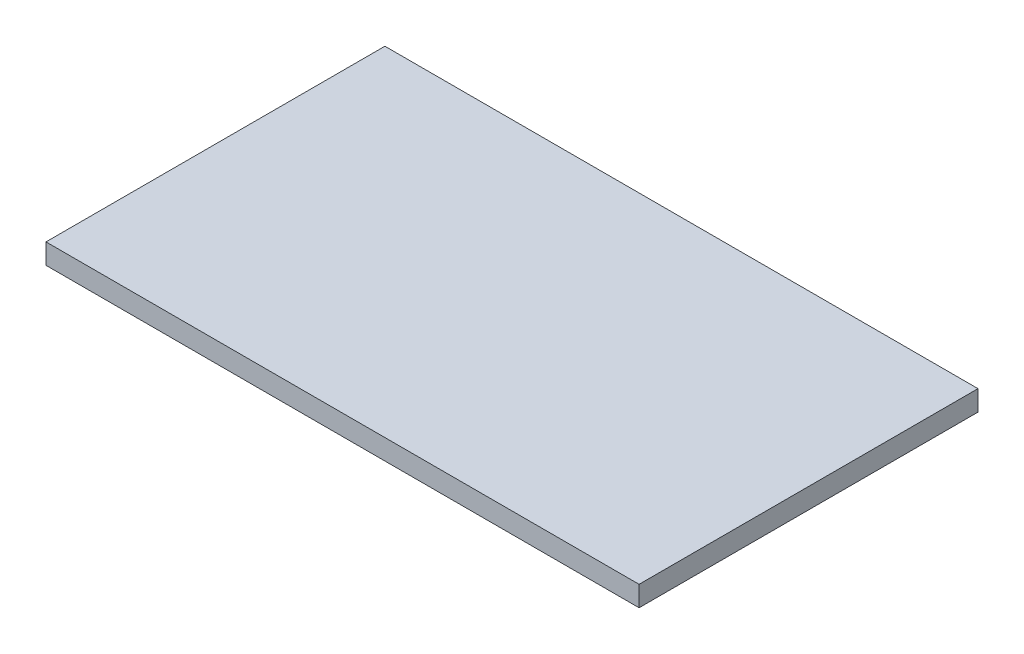
ISO-10303-21;
HEADER;
FILE_DESCRIPTION(('STEP AP214'),'2;1');
FILE_NAME('part.step','',(''),(''),'','','');
FILE_SCHEMA(('AUTOMOTIVE_DESIGN { 1 0 10303 214 1 1 1 1 }'));
ENDSEC;
DATA;
#1=APPLICATION_CONTEXT('core data for automotive mechanical design processes');
#2=APPLICATION_PROTOCOL_DEFINITION('international standard','automotive_design',2000,#1);
#3=PRODUCT_CONTEXT('',#1,'mechanical');
#4=PRODUCT('Part','Part','',(#3));
#5=PRODUCT_RELATED_PRODUCT_CATEGORY('part','',(#4));
#6=PRODUCT_DEFINITION_FORMATION('','',#4);
#7=PRODUCT_DEFINITION_CONTEXT('part definition',#1,'design');
#8=PRODUCT_DEFINITION('design','',#6,#7);
#9=PRODUCT_DEFINITION_SHAPE('','',#8);
#10=(LENGTH_UNIT() NAMED_UNIT(*) SI_UNIT(.MILLI.,.METRE.));
#11=(NAMED_UNIT(*) PLANE_ANGLE_UNIT() SI_UNIT($,.RADIAN.));
#12=(NAMED_UNIT(*) SI_UNIT($,.STERADIAN.) SOLID_ANGLE_UNIT());
#13=UNCERTAINTY_MEASURE_WITH_UNIT(LENGTH_MEASURE(1.E-05),#10,'distance_accuracy_value','');
#14=(GEOMETRIC_REPRESENTATION_CONTEXT(3) GLOBAL_UNCERTAINTY_ASSIGNED_CONTEXT((#13)) GLOBAL_UNIT_ASSIGNED_CONTEXT((#10,
#11,#12)) REPRESENTATION_CONTEXT('',''));
#15=CARTESIAN_POINT('',(0.,0.,0.));
#16=DIRECTION('',(0.,0.,1.));
#17=DIRECTION('',(1.,0.,0.));
#18=AXIS2_PLACEMENT_3D('',#15,#16,#17);
#19=CARTESIAN_POINT('',(0.,6.,0.));
#20=DIRECTION('',(1.,0.,0.));
#21=DIRECTION('',(0.,0.,-1.));
#22=AXIS2_PLACEMENT_3D('',#19,#20,#21);
#23=PLANE('',#22);
#24=DIRECTION('',(0.,0.,1.));
#25=VECTOR('',#24,1.);
#26=CARTESIAN_POINT('',(0.,0.,0.));
#27=LINE('',#26,#25);
#28=CARTESIAN_POINT('',(0.,0.,-100.));
#29=VERTEX_POINT('',#28);
#30=CARTESIAN_POINT('',(0.,0.,0.));
#31=VERTEX_POINT('',#30);
#32=EDGE_CURVE('E95',#29,#31,#27,.T.);
#33=ORIENTED_EDGE('',*,*,#32,.T.);
#34=DIRECTION('',(0.,-1.,0.));
#35=VECTOR('',#34,1.);
#36=CARTESIAN_POINT('',(0.,6.,0.));
#37=LINE('',#36,#35);
#38=CARTESIAN_POINT('',(0.,6.,0.));
#39=VERTEX_POINT('',#38);
#40=EDGE_CURVE('E11',#39,#31,#37,.T.);
#41=ORIENTED_EDGE('',*,*,#40,.F.);
#42=DIRECTION('',(0.,0.,1.));
#43=VECTOR('',#42,1.);
#44=CARTESIAN_POINT('',(0.,6.,0.));
#45=LINE('',#44,#43);
#46=CARTESIAN_POINT('',(0.,6.,-100.));
#47=VERTEX_POINT('',#46);
#48=EDGE_CURVE('E83',#47,#39,#45,.T.);
#49=ORIENTED_EDGE('',*,*,#48,.F.);
#50=DIRECTION('',(0.,-1.,0.));
#51=VECTOR('',#50,1.);
#52=CARTESIAN_POINT('',(0.,6.,-100.));
#53=LINE('',#52,#51);
#54=EDGE_CURVE('E91',#47,#29,#53,.T.);
#55=ORIENTED_EDGE('',*,*,#54,.T.);
#56=EDGE_LOOP('',(#33,#41,#49,#55));
#57=FACE_BOUND('',#56,.T.);
#58=ADVANCED_FACE('F32',(#57),#23,.F.);
#59=CARTESIAN_POINT('',(0.,6.,0.));
#60=DIRECTION('',(0.,0.,-1.));
#61=DIRECTION('',(-1.,0.,0.));
#62=AXIS2_PLACEMENT_3D('',#59,#60,#61);
#63=PLANE('',#62);
#64=DIRECTION('',(1.,0.,0.));
#65=VECTOR('',#64,1.);
#66=CARTESIAN_POINT('',(0.,0.,0.));
#67=LINE('',#66,#65);
#68=CARTESIAN_POINT('',(175.,0.,0.));
#69=VERTEX_POINT('',#68);
#70=EDGE_CURVE('E87',#31,#69,#67,.T.);
#71=ORIENTED_EDGE('',*,*,#70,.T.);
#72=DIRECTION('',(0.,-1.,0.));
#73=VECTOR('',#72,1.);
#74=CARTESIAN_POINT('',(175.,6.,0.));
#75=LINE('',#74,#73);
#76=CARTESIAN_POINT('',(175.,6.,0.));
#77=VERTEX_POINT('',#76);
#78=EDGE_CURVE('E40',#77,#69,#75,.T.);
#79=ORIENTED_EDGE('',*,*,#78,.F.);
#80=DIRECTION('',(1.,0.,0.));
#81=VECTOR('',#80,1.);
#82=CARTESIAN_POINT('',(0.,6.,0.));
#83=LINE('',#82,#81);
#84=EDGE_CURVE('E78',#39,#77,#83,.T.);
#85=ORIENTED_EDGE('',*,*,#84,.F.);
#86=ORIENTED_EDGE('',*,*,#40,.T.);
#87=EDGE_LOOP('',(#71,#79,#85,#86));
#88=FACE_BOUND('',#87,.T.);
#89=ADVANCED_FACE('F86',(#88),#63,.F.);
#90=CARTESIAN_POINT('',(175.,6.,0.));
#91=DIRECTION('',(-1.,0.,0.));
#92=DIRECTION('',(0.,0.,1.));
#93=AXIS2_PLACEMENT_3D('',#90,#91,#92);
#94=PLANE('',#93);
#95=DIRECTION('',(0.,0.,-1.));
#96=VECTOR('',#95,1.);
#97=CARTESIAN_POINT('',(175.,0.,0.));
#98=LINE('',#97,#96);
#99=CARTESIAN_POINT('',(175.,0.,-100.));
#100=VERTEX_POINT('',#99);
#101=EDGE_CURVE('E65',#69,#100,#98,.T.);
#102=ORIENTED_EDGE('',*,*,#101,.T.);
#103=DIRECTION('',(0.,-1.,0.));
#104=VECTOR('',#103,1.);
#105=CARTESIAN_POINT('',(175.,6.,-100.));
#106=LINE('',#105,#104);
#107=CARTESIAN_POINT('',(175.,6.,-100.));
#108=VERTEX_POINT('',#107);
#109=EDGE_CURVE('E88',#108,#100,#106,.T.);
#110=ORIENTED_EDGE('',*,*,#109,.F.);
#111=DIRECTION('',(0.,0.,-1.));
#112=VECTOR('',#111,1.);
#113=CARTESIAN_POINT('',(175.,6.,0.));
#114=LINE('',#113,#112);
#115=EDGE_CURVE('E81',#77,#108,#114,.T.);
#116=ORIENTED_EDGE('',*,*,#115,.F.);
#117=ORIENTED_EDGE('',*,*,#78,.T.);
#118=EDGE_LOOP('',(#102,#110,#116,#117));
#119=FACE_BOUND('',#118,.T.);
#120=ADVANCED_FACE('F89',(#119),#94,.F.);
#121=CARTESIAN_POINT('',(0.,6.,-100.));
#122=DIRECTION('',(0.,0.,1.));
#123=DIRECTION('',(1.,0.,0.));
#124=AXIS2_PLACEMENT_3D('',#121,#122,#123);
#125=PLANE('',#124);
#126=DIRECTION('',(-1.,0.,0.));
#127=VECTOR('',#126,1.);
#128=CARTESIAN_POINT('',(0.,0.,-100.));
#129=LINE('',#128,#127);
#130=EDGE_CURVE('E71',#100,#29,#129,.T.);
#131=ORIENTED_EDGE('',*,*,#130,.T.);
#132=ORIENTED_EDGE('',*,*,#54,.F.);
#133=DIRECTION('',(-1.,0.,0.));
#134=VECTOR('',#133,1.);
#135=CARTESIAN_POINT('',(0.,6.,-100.));
#136=LINE('',#135,#134);
#137=EDGE_CURVE('E48',#108,#47,#136,.T.);
#138=ORIENTED_EDGE('',*,*,#137,.F.);
#139=ORIENTED_EDGE('',*,*,#109,.T.);
#140=EDGE_LOOP('',(#131,#132,#138,#139));
#141=FACE_BOUND('',#140,.T.);
#142=ADVANCED_FACE('F102',(#141),#125,.F.);
#143=CARTESIAN_POINT('',(0.,6.,0.));
#144=DIRECTION('',(0.,-1.,0.));
#145=DIRECTION('',(0.,0.,-1.));
#146=AXIS2_PLACEMENT_3D('',#143,#144,#145);
#147=PLANE('',#146);
#148=ORIENTED_EDGE('',*,*,#48,.T.);
#149=ORIENTED_EDGE('',*,*,#84,.T.);
#150=ORIENTED_EDGE('',*,*,#115,.T.);
#151=ORIENTED_EDGE('',*,*,#137,.T.);
#152=EDGE_LOOP('',(#148,#149,#150,#151));
#153=FACE_BOUND('',#152,.T.);
#154=ADVANCED_FACE('F79',(#153),#147,.F.);
#155=CARTESIAN_POINT('',(0.,0.,0.));
#156=DIRECTION('',(0.,-1.,0.));
#157=DIRECTION('',(0.,0.,-1.));
#158=AXIS2_PLACEMENT_3D('',#155,#156,#157);
#159=PLANE('',#158);
#160=ORIENTED_EDGE('',*,*,#32,.F.);
#161=ORIENTED_EDGE('',*,*,#130,.F.);
#162=ORIENTED_EDGE('',*,*,#101,.F.);
#163=ORIENTED_EDGE('',*,*,#70,.F.);
#164=EDGE_LOOP('',(#160,#161,#162,#163));
#165=FACE_BOUND('',#164,.T.);
#166=ADVANCED_FACE('F105',(#165),#159,.T.);
#167=CLOSED_SHELL('',(#58,#89,#120,#142,#154,#166));
#168=MANIFOLD_SOLID_BREP('B2',#167);
#169=ADVANCED_BREP_SHAPE_REPRESENTATION('',(#18,#168),#14);
#170=SHAPE_DEFINITION_REPRESENTATION(#9,#169);
ENDSEC;
END-ISO-10303-21;
